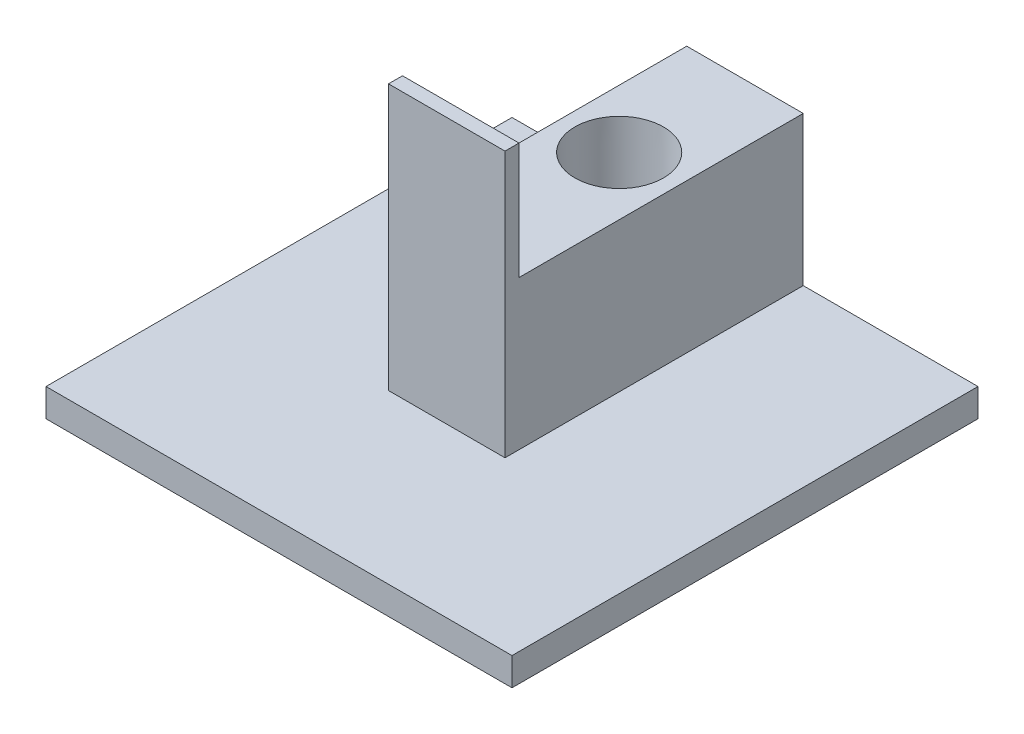
ISO-10303-21;
HEADER;
FILE_DESCRIPTION(('STEP AP214'),'2;1');
FILE_NAME('part.step','',(''),(''),'','','');
FILE_SCHEMA(('AUTOMOTIVE_DESIGN { 1 0 10303 214 1 1 1 1 }'));
ENDSEC;
DATA;
#1=APPLICATION_CONTEXT('core data for automotive mechanical design processes');
#2=APPLICATION_PROTOCOL_DEFINITION('international standard','automotive_design',2000,#1);
#3=PRODUCT_CONTEXT('',#1,'mechanical');
#4=PRODUCT('Part','Part','',(#3));
#5=PRODUCT_RELATED_PRODUCT_CATEGORY('part','',(#4));
#6=PRODUCT_DEFINITION_FORMATION('','',#4);
#7=PRODUCT_DEFINITION_CONTEXT('part definition',#1,'design');
#8=PRODUCT_DEFINITION('design','',#6,#7);
#9=PRODUCT_DEFINITION_SHAPE('','',#8);
#10=(LENGTH_UNIT() NAMED_UNIT(*) SI_UNIT(.MILLI.,.METRE.));
#11=(NAMED_UNIT(*) PLANE_ANGLE_UNIT() SI_UNIT($,.RADIAN.));
#12=(NAMED_UNIT(*) SI_UNIT($,.STERADIAN.) SOLID_ANGLE_UNIT());
#13=UNCERTAINTY_MEASURE_WITH_UNIT(LENGTH_MEASURE(1.E-05),#10,'distance_accuracy_value','');
#14=(GEOMETRIC_REPRESENTATION_CONTEXT(3) GLOBAL_UNCERTAINTY_ASSIGNED_CONTEXT((#13)) GLOBAL_UNIT_ASSIGNED_CONTEXT((#10,
#11,#12)) REPRESENTATION_CONTEXT('',''));
#15=CARTESIAN_POINT('',(0.,0.,0.));
#16=DIRECTION('',(0.,0.,1.));
#17=DIRECTION('',(1.,0.,0.));
#18=AXIS2_PLACEMENT_3D('',#15,#16,#17);
#19=CARTESIAN_POINT('',(-48.75,38.,-25.7142857142857));
#20=DIRECTION('',(1.,0.,0.));
#21=DIRECTION('',(0.,0.,-1.));
#22=AXIS2_PLACEMENT_3D('',#19,#20,#21);
#23=PLANE('',#22);
#24=DIRECTION('',(0.,0.,1.));
#25=VECTOR('',#24,1.);
#26=CARTESIAN_POINT('',(-48.75,6.,-25.7142857142857));
#27=LINE('',#26,#25);
#28=CARTESIAN_POINT('',(-48.75,6.,-25.7142857142857));
#29=VERTEX_POINT('',#28);
#30=CARTESIAN_POINT('',(-48.75,6.,74.2857142857143));
#31=VERTEX_POINT('',#30);
#32=EDGE_CURVE('E137',#29,#31,#27,.T.);
#33=ORIENTED_EDGE('',*,*,#32,.F.);
#34=DIRECTION('',(0.,-1.,0.));
#35=VECTOR('',#34,1.);
#36=CARTESIAN_POINT('',(-48.75,38.,-25.7142857142857));
#37=LINE('',#36,#35);
#38=CARTESIAN_POINT('',(-48.75,0.,-25.7142857142857));
#39=VERTEX_POINT('',#38);
#40=EDGE_CURVE('E57',#29,#39,#37,.T.);
#41=ORIENTED_EDGE('',*,*,#40,.T.);
#42=DIRECTION('',(0.,0.,1.));
#43=VECTOR('',#42,1.);
#44=CARTESIAN_POINT('',(-48.75,0.,-25.7142857142857));
#45=LINE('',#44,#43);
#46=CARTESIAN_POINT('',(-48.75,0.,74.2857142857143));
#47=VERTEX_POINT('',#46);
#48=EDGE_CURVE('E181',#39,#47,#45,.T.);
#49=ORIENTED_EDGE('',*,*,#48,.T.);
#50=DIRECTION('',(0.,-1.,0.));
#51=VECTOR('',#50,1.);
#52=CARTESIAN_POINT('',(-48.75,38.,74.2857142857143));
#53=LINE('',#52,#51);
#54=EDGE_CURVE('E199',#31,#47,#53,.T.);
#55=ORIENTED_EDGE('',*,*,#54,.F.);
#56=EDGE_LOOP('',(#33,#41,#49,#55));
#57=FACE_BOUND('',#56,.T.);
#58=ADVANCED_FACE('F35',(#57),#23,.F.);
#59=CARTESIAN_POINT('',(-48.75,38.,74.2857142857143));
#60=DIRECTION('',(0.,0.,-1.));
#61=DIRECTION('',(-1.,0.,0.));
#62=AXIS2_PLACEMENT_3D('',#59,#60,#61);
#63=PLANE('',#62);
#64=DIRECTION('',(1.,0.,0.));
#65=VECTOR('',#64,1.);
#66=CARTESIAN_POINT('',(-48.75,6.,74.2857142857143));
#67=LINE('',#66,#65);
#68=CARTESIAN_POINT('',(51.25,6.,74.2857142857143));
#69=VERTEX_POINT('',#68);
#70=EDGE_CURVE('E143',#31,#69,#67,.T.);
#71=ORIENTED_EDGE('',*,*,#70,.F.);
#72=ORIENTED_EDGE('',*,*,#54,.T.);
#73=DIRECTION('',(1.,0.,0.));
#74=VECTOR('',#73,1.);
#75=CARTESIAN_POINT('',(-48.75,0.,74.2857142857143));
#76=LINE('',#75,#74);
#77=CARTESIAN_POINT('',(51.25,0.,74.2857142857143));
#78=VERTEX_POINT('',#77);
#79=EDGE_CURVE('E187',#47,#78,#76,.T.);
#80=ORIENTED_EDGE('',*,*,#79,.T.);
#81=DIRECTION('',(0.,-1.,0.));
#82=VECTOR('',#81,1.);
#83=CARTESIAN_POINT('',(51.25,38.,74.2857142857143));
#84=LINE('',#83,#82);
#85=EDGE_CURVE('E197',#69,#78,#84,.T.);
#86=ORIENTED_EDGE('',*,*,#85,.F.);
#87=EDGE_LOOP('',(#71,#72,#80,#86));
#88=FACE_BOUND('',#87,.T.);
#89=ADVANCED_FACE('F242',(#88),#63,.F.);
#90=CARTESIAN_POINT('',(51.25,38.,-25.7142857142857));
#91=DIRECTION('',(-1.,0.,0.));
#92=DIRECTION('',(0.,0.,1.));
#93=AXIS2_PLACEMENT_3D('',#90,#91,#92);
#94=PLANE('',#93);
#95=DIRECTION('',(0.,0.,-1.));
#96=VECTOR('',#95,1.);
#97=CARTESIAN_POINT('',(51.25,6.,-25.7142857142857));
#98=LINE('',#97,#96);
#99=CARTESIAN_POINT('',(51.25,6.,-25.7142857142857));
#100=VERTEX_POINT('',#99);
#101=EDGE_CURVE('E145',#69,#100,#98,.T.);
#102=ORIENTED_EDGE('',*,*,#101,.F.);
#103=ORIENTED_EDGE('',*,*,#85,.T.);
#104=DIRECTION('',(0.,0.,-1.));
#105=VECTOR('',#104,1.);
#106=CARTESIAN_POINT('',(51.25,0.,-25.7142857142857));
#107=LINE('',#106,#105);
#108=CARTESIAN_POINT('',(51.25,0.,-25.7142857142857));
#109=VERTEX_POINT('',#108);
#110=EDGE_CURVE('E190',#78,#109,#107,.T.);
#111=ORIENTED_EDGE('',*,*,#110,.T.);
#112=DIRECTION('',(0.,-1.,0.));
#113=VECTOR('',#112,1.);
#114=CARTESIAN_POINT('',(51.25,38.,-25.7142857142857));
#115=LINE('',#114,#113);
#116=EDGE_CURVE('E195',#100,#109,#115,.T.);
#117=ORIENTED_EDGE('',*,*,#116,.F.);
#118=EDGE_LOOP('',(#102,#103,#111,#117));
#119=FACE_BOUND('',#118,.T.);
#120=ADVANCED_FACE('F246',(#119),#94,.F.);
#121=CARTESIAN_POINT('',(0.,38.,0.));
#122=DIRECTION('',(0.,1.,0.));
#123=DIRECTION('',(0.,0.,1.));
#124=AXIS2_PLACEMENT_3D('',#121,#122,#123);
#125=PLANE('',#124);
#126=DIRECTION('',(0.,0.,-1.));
#127=VECTOR('',#126,1.);
#128=CARTESIAN_POINT('',(-11.25,38.,-27.7514031268372));
#129=LINE('',#128,#127);
#130=CARTESIAN_POINT('',(-11.25,38.,35.2857142857143));
#131=VERTEX_POINT('',#130);
#132=CARTESIAN_POINT('',(-11.25,38.,-25.7142857142857));
#133=VERTEX_POINT('',#132);
#134=EDGE_CURVE('E130',#131,#133,#129,.T.);
#135=ORIENTED_EDGE('',*,*,#134,.F.);
#136=DIRECTION('',(-1.,0.,0.));
#137=VECTOR('',#136,1.);
#138=CARTESIAN_POINT('',(-11.25,38.,35.2857142857143));
#139=LINE('',#138,#137);
#140=CARTESIAN_POINT('',(13.75,38.,35.2857142857143));
#141=VERTEX_POINT('',#140);
#142=EDGE_CURVE('E147',#141,#131,#139,.T.);
#143=ORIENTED_EDGE('',*,*,#142,.F.);
#144=DIRECTION('',(0.,0.,1.));
#145=VECTOR('',#144,1.);
#146=CARTESIAN_POINT('',(13.75,38.,-28.5566196438593));
#147=LINE('',#146,#145);
#148=CARTESIAN_POINT('',(13.75,38.,-25.7142857142857));
#149=VERTEX_POINT('',#148);
#150=EDGE_CURVE('E49',#149,#141,#147,.T.);
#151=ORIENTED_EDGE('',*,*,#150,.F.);
#152=DIRECTION('',(-1.,0.,0.));
#153=VECTOR('',#152,1.);
#154=CARTESIAN_POINT('',(-48.75,38.,-25.7142857142857));
#155=LINE('',#154,#153);
#156=EDGE_CURVE('E182',#149,#133,#155,.T.);
#157=ORIENTED_EDGE('',*,*,#156,.T.);
#158=EDGE_LOOP('',(#135,#143,#151,#157));
#159=FACE_BOUND('',#158,.T.);
#160=CARTESIAN_POINT('',(1.24999999999998,38.,1.28571428571429));
#161=DIRECTION('',(0.,1.,0.));
#162=DIRECTION('',(0.,0.,1.));
#163=AXIS2_PLACEMENT_3D('',#160,#161,#162);
#164=CIRCLE('',#163,9.5);
#165=CARTESIAN_POINT('',(1.24999999999998,38.,10.7857142857143));
#166=VERTEX_POINT('',#165);
#167=EDGE_CURVE('E166',#166,#166,#164,.T.);
#168=ORIENTED_EDGE('',*,*,#167,.F.);
#169=EDGE_LOOP('',(#168));
#170=FACE_BOUND('',#169,.T.);
#171=ADVANCED_FACE('F222',(#159,#170),#125,.T.);
#172=CARTESIAN_POINT('',(-48.75,38.,-25.7142857142857));
#173=DIRECTION('',(0.,0.,1.));
#174=DIRECTION('',(1.,0.,0.));
#175=AXIS2_PLACEMENT_3D('',#172,#173,#174);
#176=PLANE('',#175);
#177=ORIENTED_EDGE('',*,*,#156,.F.);
#178=DIRECTION('',(0.,-1.,0.));
#179=VECTOR('',#178,1.);
#180=CARTESIAN_POINT('',(13.75,38.,-25.7142857142857));
#181=LINE('',#180,#179);
#182=CARTESIAN_POINT('',(13.75,6.,-25.7142857142857));
#183=VERTEX_POINT('',#182);
#184=EDGE_CURVE('E12',#149,#183,#181,.T.);
#185=ORIENTED_EDGE('',*,*,#184,.T.);
#186=DIRECTION('',(-1.,0.,0.));
#187=VECTOR('',#186,1.);
#188=CARTESIAN_POINT('',(-48.75,6.,-25.7142857142857));
#189=LINE('',#188,#187);
#190=EDGE_CURVE('E42',#100,#183,#189,.T.);
#191=ORIENTED_EDGE('',*,*,#190,.F.);
#192=ORIENTED_EDGE('',*,*,#116,.T.);
#193=DIRECTION('',(-1.,0.,0.));
#194=VECTOR('',#193,1.);
#195=CARTESIAN_POINT('',(-48.75,0.,-25.7142857142857));
#196=LINE('',#195,#194);
#197=EDGE_CURVE('E185',#109,#39,#196,.T.);
#198=ORIENTED_EDGE('',*,*,#197,.T.);
#199=ORIENTED_EDGE('',*,*,#40,.F.);
#200=CARTESIAN_POINT('',(-11.25,6.,-25.7142857142857));
#201=VERTEX_POINT('',#200);
#202=EDGE_CURVE('E213',#201,#29,#189,.T.);
#203=ORIENTED_EDGE('',*,*,#202,.F.);
#204=DIRECTION('',(0.,1.,0.));
#205=VECTOR('',#204,1.);
#206=CARTESIAN_POINT('',(-11.25,38.,-25.7142857142857));
#207=LINE('',#206,#205);
#208=EDGE_CURVE('E214',#201,#133,#207,.T.);
#209=ORIENTED_EDGE('',*,*,#208,.T.);
#210=EDGE_LOOP('',(#177,#185,#191,#192,#198,#199,#203,#209));
#211=FACE_BOUND('',#210,.T.);
#212=ADVANCED_FACE('F219',(#211),#176,.F.);
#213=CARTESIAN_POINT('',(0.,0.,0.));
#214=DIRECTION('',(0.,1.,0.));
#215=DIRECTION('',(0.,0.,1.));
#216=AXIS2_PLACEMENT_3D('',#213,#214,#215);
#217=PLANE('',#216);
#218=CARTESIAN_POINT('',(1.24999999999998,0.,1.28571428571429));
#219=DIRECTION('',(0.,-1.,0.));
#220=DIRECTION('',(0.,0.,-1.));
#221=AXIS2_PLACEMENT_3D('',#218,#219,#220);
#222=CIRCLE('',#221,8.25);
#223=CARTESIAN_POINT('',(1.24999999999998,0.,-6.96428571428571));
#224=VERTEX_POINT('',#223);
#225=EDGE_CURVE('E163',#224,#224,#222,.T.);
#226=ORIENTED_EDGE('',*,*,#225,.F.);
#227=EDGE_LOOP('',(#226));
#228=FACE_BOUND('',#227,.T.);
#229=CARTESIAN_POINT('',(-27.0342712474614,0.,-3.99855696174734));
#230=DIRECTION('',(0.,1.,0.));
#231=DIRECTION('',(0.,0.,1.));
#232=AXIS2_PLACEMENT_3D('',#229,#230,#231);
#233=CIRCLE('',#232,2.99999999999999);
#234=CARTESIAN_POINT('',(-27.0342712474614,0.,-0.998556961747344));
#235=VERTEX_POINT('',#234);
#236=EDGE_CURVE('E210',#235,#235,#233,.F.);
#237=ORIENTED_EDGE('',*,*,#236,.F.);
#238=EDGE_LOOP('',(#237));
#239=FACE_BOUND('',#238,.T.);
#240=CARTESIAN_POINT('',(29.5342712474625,0.,-3.99855696174699));
#241=DIRECTION('',(0.,1.,0.));
#242=DIRECTION('',(0.,0.,1.));
#243=AXIS2_PLACEMENT_3D('',#240,#241,#242);
#244=CIRCLE('',#243,3.);
#245=CARTESIAN_POINT('',(29.5342712474625,0.,-0.998556961746989));
#246=VERTEX_POINT('',#245);
#247=EDGE_CURVE('E207',#246,#246,#244,.F.);
#248=ORIENTED_EDGE('',*,*,#247,.F.);
#249=EDGE_LOOP('',(#248));
#250=FACE_BOUND('',#249,.T.);
#251=CARTESIAN_POINT('',(29.534271247462,0.,52.5699855331769));
#252=DIRECTION('',(0.,1.,0.));
#253=DIRECTION('',(0.,0.,1.));
#254=AXIS2_PLACEMENT_3D('',#251,#252,#253);
#255=CIRCLE('',#254,3.);
#256=CARTESIAN_POINT('',(29.534271247462,0.,55.5699855331769));
#257=VERTEX_POINT('',#256);
#258=EDGE_CURVE('E204',#257,#257,#255,.F.);
#259=ORIENTED_EDGE('',*,*,#258,.F.);
#260=EDGE_LOOP('',(#259));
#261=FACE_BOUND('',#260,.T.);
#262=CARTESIAN_POINT('',(-27.0342712474619,0.,52.5699855331762));
#263=DIRECTION('',(0.,1.,0.));
#264=DIRECTION('',(0.,0.,1.));
#265=AXIS2_PLACEMENT_3D('',#262,#263,#264);
#266=CIRCLE('',#265,3.);
#267=CARTESIAN_POINT('',(-27.0342712474619,0.,55.5699855331762));
#268=VERTEX_POINT('',#267);
#269=EDGE_CURVE('E201',#268,#268,#266,.F.);
#270=ORIENTED_EDGE('',*,*,#269,.F.);
#271=EDGE_LOOP('',(#270));
#272=FACE_BOUND('',#271,.T.);
#273=ORIENTED_EDGE('',*,*,#48,.F.);
#274=ORIENTED_EDGE('',*,*,#197,.F.);
#275=ORIENTED_EDGE('',*,*,#110,.F.);
#276=ORIENTED_EDGE('',*,*,#79,.F.);
#277=EDGE_LOOP('',(#273,#274,#275,#276));
#278=FACE_BOUND('',#277,.T.);
#279=ADVANCED_FACE('F256',(#228,#239,#250,#261,#272,#278),#217,.F.);
#280=CARTESIAN_POINT('',(-27.0342712474619,-3.,52.5699855331762));
#281=DIRECTION('',(0.,1.,0.));
#282=DIRECTION('',(0.,0.,1.));
#283=AXIS2_PLACEMENT_3D('',#280,#281,#282);
#284=CYLINDRICAL_SURFACE('',#283,3.);
#285=CARTESIAN_POINT('',(-27.0342712474619,-3.,52.5699855331762));
#286=DIRECTION('',(0.,-1.,0.));
#287=DIRECTION('',(0.,0.,-1.));
#288=AXIS2_PLACEMENT_3D('',#285,#286,#287);
#289=CIRCLE('',#288,3.);
#290=CARTESIAN_POINT('',(-27.0342712474619,-3.,49.5699855331762));
#291=VERTEX_POINT('',#290);
#292=EDGE_CURVE('E178',#291,#291,#289,.T.);
#293=ORIENTED_EDGE('',*,*,#292,.F.);
#294=EDGE_LOOP('',(#293));
#295=FACE_BOUND('',#294,.T.);
#296=ORIENTED_EDGE('',*,*,#269,.T.);
#297=EDGE_LOOP('',(#296));
#298=FACE_BOUND('',#297,.T.);
#299=ADVANCED_FACE('F270',(#295,#298),#284,.T.);
#300=CARTESIAN_POINT('',(-27.0342712474619,-3.,52.5699855331762));
#301=DIRECTION('',(0.,-1.,0.));
#302=DIRECTION('',(0.,0.,-1.));
#303=AXIS2_PLACEMENT_3D('',#300,#301,#302);
#304=PLANE('',#303);
#305=ORIENTED_EDGE('',*,*,#292,.T.);
#306=EDGE_LOOP('',(#305));
#307=FACE_BOUND('',#306,.T.);
#308=ADVANCED_FACE('F275',(#307),#304,.T.);
#309=CARTESIAN_POINT('',(29.534271247462,-3.,52.5699855331769));
#310=DIRECTION('',(0.,1.,0.));
#311=DIRECTION('',(0.,0.,1.));
#312=AXIS2_PLACEMENT_3D('',#309,#310,#311);
#313=CYLINDRICAL_SURFACE('',#312,3.);
#314=CARTESIAN_POINT('',(29.534271247462,-3.,52.5699855331769));
#315=DIRECTION('',(0.,-1.,0.));
#316=DIRECTION('',(0.,0.,-1.));
#317=AXIS2_PLACEMENT_3D('',#314,#315,#316);
#318=CIRCLE('',#317,3.);
#319=CARTESIAN_POINT('',(29.534271247462,-3.,49.5699855331769));
#320=VERTEX_POINT('',#319);
#321=EDGE_CURVE('E175',#320,#320,#318,.T.);
#322=ORIENTED_EDGE('',*,*,#321,.F.);
#323=EDGE_LOOP('',(#322));
#324=FACE_BOUND('',#323,.T.);
#325=ORIENTED_EDGE('',*,*,#258,.T.);
#326=EDGE_LOOP('',(#325));
#327=FACE_BOUND('',#326,.T.);
#328=ADVANCED_FACE('F279',(#324,#327),#313,.T.);
#329=CARTESIAN_POINT('',(29.534271247462,-3.,52.5699855331769));
#330=DIRECTION('',(0.,-1.,0.));
#331=DIRECTION('',(0.,0.,-1.));
#332=AXIS2_PLACEMENT_3D('',#329,#330,#331);
#333=PLANE('',#332);
#334=ORIENTED_EDGE('',*,*,#321,.T.);
#335=EDGE_LOOP('',(#334));
#336=FACE_BOUND('',#335,.T.);
#337=ADVANCED_FACE('F283',(#336),#333,.T.);
#338=CARTESIAN_POINT('',(29.5342712474625,-3.,-3.99855696174699));
#339=DIRECTION('',(0.,1.,0.));
#340=DIRECTION('',(0.,0.,1.));
#341=AXIS2_PLACEMENT_3D('',#338,#339,#340);
#342=CYLINDRICAL_SURFACE('',#341,3.);
#343=CARTESIAN_POINT('',(29.5342712474625,-3.,-3.99855696174699));
#344=DIRECTION('',(0.,-1.,0.));
#345=DIRECTION('',(0.,0.,-1.));
#346=AXIS2_PLACEMENT_3D('',#343,#344,#345);
#347=CIRCLE('',#346,3.);
#348=CARTESIAN_POINT('',(29.5342712474625,-3.,-6.99855696174699));
#349=VERTEX_POINT('',#348);
#350=EDGE_CURVE('E172',#349,#349,#347,.T.);
#351=ORIENTED_EDGE('',*,*,#350,.F.);
#352=EDGE_LOOP('',(#351));
#353=FACE_BOUND('',#352,.T.);
#354=ORIENTED_EDGE('',*,*,#247,.T.);
#355=EDGE_LOOP('',(#354));
#356=FACE_BOUND('',#355,.T.);
#357=ADVANCED_FACE('F287',(#353,#356),#342,.T.);
#358=CARTESIAN_POINT('',(29.5342712474625,-3.,-3.99855696174699));
#359=DIRECTION('',(0.,-1.,0.));
#360=DIRECTION('',(0.,0.,-1.));
#361=AXIS2_PLACEMENT_3D('',#358,#359,#360);
#362=PLANE('',#361);
#363=ORIENTED_EDGE('',*,*,#350,.T.);
#364=EDGE_LOOP('',(#363));
#365=FACE_BOUND('',#364,.T.);
#366=ADVANCED_FACE('F291',(#365),#362,.T.);
#367=CARTESIAN_POINT('',(-27.0342712474614,-3.,-3.99855696174734));
#368=DIRECTION('',(0.,1.,0.));
#369=DIRECTION('',(0.,0.,1.));
#370=AXIS2_PLACEMENT_3D('',#367,#368,#369);
#371=CYLINDRICAL_SURFACE('',#370,2.99999999999999);
#372=CARTESIAN_POINT('',(-27.0342712474614,-3.,-3.99855696174734));
#373=DIRECTION('',(0.,-1.,0.));
#374=DIRECTION('',(0.,0.,-1.));
#375=AXIS2_PLACEMENT_3D('',#372,#373,#374);
#376=CIRCLE('',#375,2.99999999999999);
#377=CARTESIAN_POINT('',(-27.0342712474614,-3.,-6.99855696174733));
#378=VERTEX_POINT('',#377);
#379=EDGE_CURVE('E169',#378,#378,#376,.T.);
#380=ORIENTED_EDGE('',*,*,#379,.F.);
#381=EDGE_LOOP('',(#380));
#382=FACE_BOUND('',#381,.T.);
#383=ORIENTED_EDGE('',*,*,#236,.T.);
#384=EDGE_LOOP('',(#383));
#385=FACE_BOUND('',#384,.T.);
#386=ADVANCED_FACE('F295',(#382,#385),#371,.T.);
#387=CARTESIAN_POINT('',(-27.0342712474614,-3.,-3.99855696174734));
#388=DIRECTION('',(0.,-1.,0.));
#389=DIRECTION('',(0.,0.,-1.));
#390=AXIS2_PLACEMENT_3D('',#387,#388,#389);
#391=PLANE('',#390);
#392=ORIENTED_EDGE('',*,*,#379,.T.);
#393=EDGE_LOOP('',(#392));
#394=FACE_BOUND('',#393,.T.);
#395=ADVANCED_FACE('F299',(#394),#391,.T.);
#396=CARTESIAN_POINT('',(1.24999999999998,0.,1.28571428571429));
#397=DIRECTION('',(0.,1.,0.));
#398=DIRECTION('',(0.,0.,1.));
#399=AXIS2_PLACEMENT_3D('',#396,#397,#398);
#400=CONICAL_SURFACE('',#399,8.25,0.032882879805512);
#401=ORIENTED_EDGE('',*,*,#225,.T.);
#402=EDGE_LOOP('',(#401));
#403=FACE_BOUND('',#402,.T.);
#404=ORIENTED_EDGE('',*,*,#167,.T.);
#405=EDGE_LOOP('',(#404));
#406=FACE_BOUND('',#405,.T.);
#407=ADVANCED_FACE('F303',(#403,#406),#400,.F.);
#408=CARTESIAN_POINT('',(-11.25,63.,35.2857142857143));
#409=DIRECTION('',(1.,0.,0.));
#410=DIRECTION('',(0.,0.,-1.));
#411=AXIS2_PLACEMENT_3D('',#408,#409,#410);
#412=PLANE('',#411);
#413=DIRECTION('',(0.,-1.,0.));
#414=VECTOR('',#413,1.);
#415=CARTESIAN_POINT('',(-11.25,63.,35.2857142857143));
#416=LINE('',#415,#414);
#417=CARTESIAN_POINT('',(-11.25,63.,35.2857142857143));
#418=VERTEX_POINT('',#417);
#419=EDGE_CURVE('E156',#418,#131,#416,.T.);
#420=ORIENTED_EDGE('',*,*,#419,.T.);
#421=ORIENTED_EDGE('',*,*,#134,.T.);
#422=ORIENTED_EDGE('',*,*,#208,.F.);
#423=DIRECTION('',(0.,0.,-1.));
#424=VECTOR('',#423,1.);
#425=CARTESIAN_POINT('',(-11.25,6.,-27.7514031268372));
#426=LINE('',#425,#424);
#427=CARTESIAN_POINT('',(-11.25,6.,38.2857142857143));
#428=VERTEX_POINT('',#427);
#429=EDGE_CURVE('E135',#428,#201,#426,.T.);
#430=ORIENTED_EDGE('',*,*,#429,.F.);
#431=DIRECTION('',(0.,-1.,0.));
#432=VECTOR('',#431,1.);
#433=CARTESIAN_POINT('',(-11.25,63.,38.2857142857143));
#434=LINE('',#433,#432);
#435=CARTESIAN_POINT('',(-11.25,63.,38.2857142857143));
#436=VERTEX_POINT('',#435);
#437=EDGE_CURVE('E121',#436,#428,#434,.T.);
#438=ORIENTED_EDGE('',*,*,#437,.F.);
#439=DIRECTION('',(0.,0.,1.));
#440=VECTOR('',#439,1.);
#441=CARTESIAN_POINT('',(-11.25,63.,35.2857142857143));
#442=LINE('',#441,#440);
#443=EDGE_CURVE('E148',#418,#436,#442,.T.);
#444=ORIENTED_EDGE('',*,*,#443,.F.);
#445=EDGE_LOOP('',(#420,#421,#422,#430,#438,#444));
#446=FACE_BOUND('',#445,.T.);
#447=ADVANCED_FACE('F230',(#446),#412,.F.);
#448=CARTESIAN_POINT('',(-11.25,63.,38.2857142857143));
#449=DIRECTION('',(0.,0.,-1.));
#450=DIRECTION('',(-1.,0.,0.));
#451=AXIS2_PLACEMENT_3D('',#448,#449,#450);
#452=PLANE('',#451);
#453=ORIENTED_EDGE('',*,*,#437,.T.);
#454=DIRECTION('',(-1.,0.,0.));
#455=VECTOR('',#454,1.);
#456=CARTESIAN_POINT('',(-11.25,6.,38.2857142857143));
#457=LINE('',#456,#455);
#458=CARTESIAN_POINT('',(13.75,6.,38.2857142857143));
#459=VERTEX_POINT('',#458);
#460=EDGE_CURVE('E128',#459,#428,#457,.T.);
#461=ORIENTED_EDGE('',*,*,#460,.F.);
#462=DIRECTION('',(0.,-1.,0.));
#463=VECTOR('',#462,1.);
#464=CARTESIAN_POINT('',(13.75,63.,38.2857142857143));
#465=LINE('',#464,#463);
#466=CARTESIAN_POINT('',(13.75,63.,38.2857142857143));
#467=VERTEX_POINT('',#466);
#468=EDGE_CURVE('E114',#467,#459,#465,.T.);
#469=ORIENTED_EDGE('',*,*,#468,.F.);
#470=DIRECTION('',(1.,0.,0.));
#471=VECTOR('',#470,1.);
#472=CARTESIAN_POINT('',(-11.25,63.,38.2857142857143));
#473=LINE('',#472,#471);
#474=EDGE_CURVE('E151',#436,#467,#473,.T.);
#475=ORIENTED_EDGE('',*,*,#474,.F.);
#476=EDGE_LOOP('',(#453,#461,#469,#475));
#477=FACE_BOUND('',#476,.T.);
#478=ADVANCED_FACE('F132',(#477),#452,.F.);
#479=CARTESIAN_POINT('',(13.75,63.,35.2857142857143));
#480=DIRECTION('',(-1.,0.,0.));
#481=DIRECTION('',(0.,0.,1.));
#482=AXIS2_PLACEMENT_3D('',#479,#480,#481);
#483=PLANE('',#482);
#484=ORIENTED_EDGE('',*,*,#468,.T.);
#485=DIRECTION('',(0.,0.,1.));
#486=VECTOR('',#485,1.);
#487=CARTESIAN_POINT('',(13.75,6.,-28.5566196438593));
#488=LINE('',#487,#486);
#489=EDGE_CURVE('E117',#183,#459,#488,.T.);
#490=ORIENTED_EDGE('',*,*,#489,.F.);
#491=ORIENTED_EDGE('',*,*,#184,.F.);
#492=ORIENTED_EDGE('',*,*,#150,.T.);
#493=DIRECTION('',(0.,-1.,0.));
#494=VECTOR('',#493,1.);
#495=CARTESIAN_POINT('',(13.75,63.,35.2857142857143));
#496=LINE('',#495,#494);
#497=CARTESIAN_POINT('',(13.75,63.,35.2857142857143));
#498=VERTEX_POINT('',#497);
#499=EDGE_CURVE('E122',#498,#141,#496,.T.);
#500=ORIENTED_EDGE('',*,*,#499,.F.);
#501=DIRECTION('',(0.,0.,-1.));
#502=VECTOR('',#501,1.);
#503=CARTESIAN_POINT('',(13.75,63.,35.2857142857143));
#504=LINE('',#503,#502);
#505=EDGE_CURVE('E118',#467,#498,#504,.T.);
#506=ORIENTED_EDGE('',*,*,#505,.F.);
#507=EDGE_LOOP('',(#484,#490,#491,#492,#500,#506));
#508=FACE_BOUND('',#507,.T.);
#509=ADVANCED_FACE('F116',(#508),#483,.F.);
#510=CARTESIAN_POINT('',(-11.25,63.,35.2857142857143));
#511=DIRECTION('',(0.,0.,1.));
#512=DIRECTION('',(1.,0.,0.));
#513=AXIS2_PLACEMENT_3D('',#510,#511,#512);
#514=PLANE('',#513);
#515=ORIENTED_EDGE('',*,*,#142,.T.);
#516=ORIENTED_EDGE('',*,*,#419,.F.);
#517=DIRECTION('',(-1.,0.,0.));
#518=VECTOR('',#517,1.);
#519=CARTESIAN_POINT('',(-11.25,63.,35.2857142857143));
#520=LINE('',#519,#518);
#521=EDGE_CURVE('E154',#498,#418,#520,.T.);
#522=ORIENTED_EDGE('',*,*,#521,.F.);
#523=ORIENTED_EDGE('',*,*,#499,.T.);
#524=EDGE_LOOP('',(#515,#516,#522,#523));
#525=FACE_BOUND('',#524,.T.);
#526=ADVANCED_FACE('F227',(#525),#514,.F.);
#527=CARTESIAN_POINT('',(0.,63.,0.));
#528=DIRECTION('',(0.,1.,0.));
#529=DIRECTION('',(0.,0.,1.));
#530=AXIS2_PLACEMENT_3D('',#527,#528,#529);
#531=PLANE('',#530);
#532=ORIENTED_EDGE('',*,*,#443,.T.);
#533=ORIENTED_EDGE('',*,*,#474,.T.);
#534=ORIENTED_EDGE('',*,*,#505,.T.);
#535=ORIENTED_EDGE('',*,*,#521,.T.);
#536=EDGE_LOOP('',(#532,#533,#534,#535));
#537=FACE_BOUND('',#536,.T.);
#538=ADVANCED_FACE('F232',(#537),#531,.T.);
#539=CARTESIAN_POINT('',(0.,6.,0.));
#540=DIRECTION('',(0.,1.,0.));
#541=DIRECTION('',(0.,0.,1.));
#542=AXIS2_PLACEMENT_3D('',#539,#540,#541);
#543=PLANE('',#542);
#544=ORIENTED_EDGE('',*,*,#190,.T.);
#545=ORIENTED_EDGE('',*,*,#489,.T.);
#546=ORIENTED_EDGE('',*,*,#460,.T.);
#547=ORIENTED_EDGE('',*,*,#429,.T.);
#548=ORIENTED_EDGE('',*,*,#202,.T.);
#549=ORIENTED_EDGE('',*,*,#32,.T.);
#550=ORIENTED_EDGE('',*,*,#70,.T.);
#551=ORIENTED_EDGE('',*,*,#101,.T.);
#552=EDGE_LOOP('',(#544,#545,#546,#547,#548,#549,#550,#551));
#553=FACE_BOUND('',#552,.T.);
#554=ADVANCED_FACE('F126',(#553),#543,.T.);
#555=CLOSED_SHELL('',(#58,#89,#120,#171,#212,#279,#299,#308,#328,#337,#357,#366,#386,#395,#407,
#447,#478,#509,#526,#538,#554));
#556=MANIFOLD_SOLID_BREP('B2',#555);
#557=ADVANCED_BREP_SHAPE_REPRESENTATION('',(#18,#556),#14);
#558=SHAPE_DEFINITION_REPRESENTATION(#9,#557);
ENDSEC;
END-ISO-10303-21;
